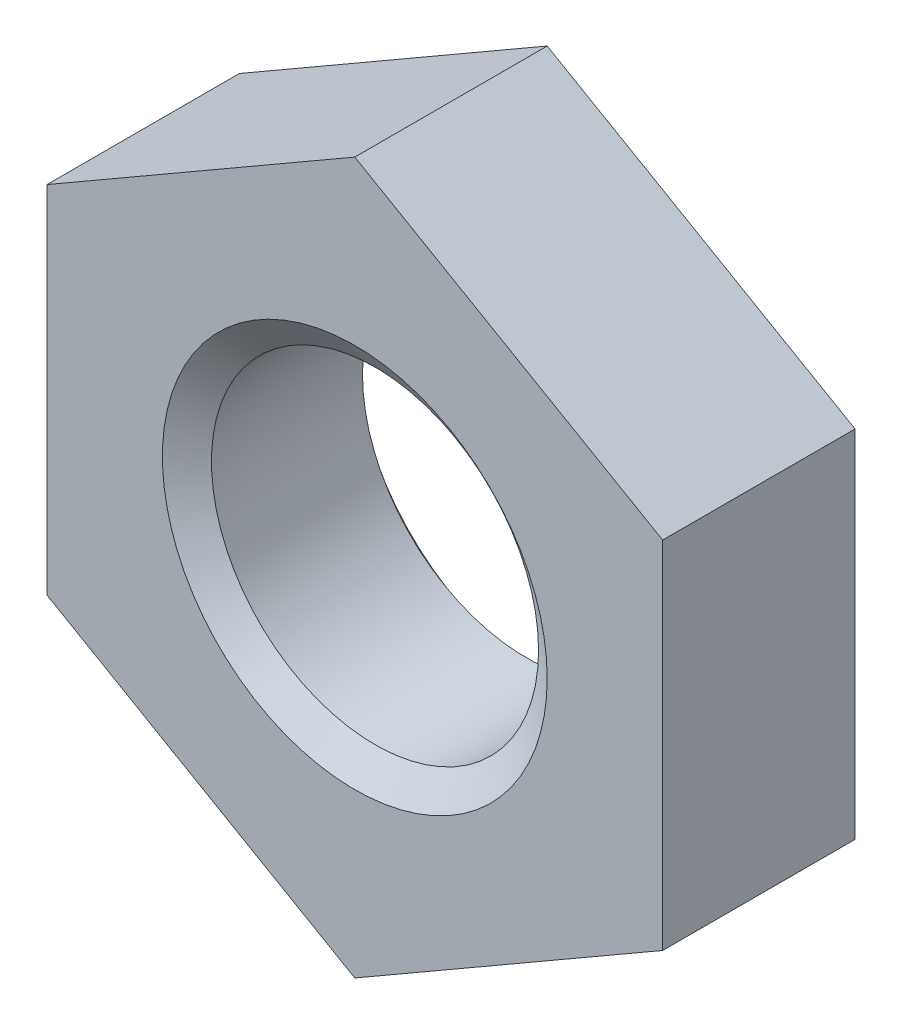
ISO-10303-21;
HEADER;
FILE_DESCRIPTION(('STEP AP214'),'2;1');
FILE_NAME('part.step','',(''),(''),'','','');
FILE_SCHEMA(('AUTOMOTIVE_DESIGN { 1 0 10303 214 1 1 1 1 }'));
ENDSEC;
DATA;
#1=APPLICATION_CONTEXT('core data for automotive mechanical design processes');
#2=APPLICATION_PROTOCOL_DEFINITION('international standard','automotive_design',2000,#1);
#3=PRODUCT_CONTEXT('',#1,'mechanical');
#4=PRODUCT('Part','Part','',(#3));
#5=PRODUCT_RELATED_PRODUCT_CATEGORY('part','',(#4));
#6=PRODUCT_DEFINITION_FORMATION('','',#4);
#7=PRODUCT_DEFINITION_CONTEXT('part definition',#1,'design');
#8=PRODUCT_DEFINITION('design','',#6,#7);
#9=PRODUCT_DEFINITION_SHAPE('','',#8);
#10=(LENGTH_UNIT() NAMED_UNIT(*) SI_UNIT(.MILLI.,.METRE.));
#11=(NAMED_UNIT(*) PLANE_ANGLE_UNIT() SI_UNIT($,.RADIAN.));
#12=(NAMED_UNIT(*) SI_UNIT($,.STERADIAN.) SOLID_ANGLE_UNIT());
#13=UNCERTAINTY_MEASURE_WITH_UNIT(LENGTH_MEASURE(1.E-05),#10,'distance_accuracy_value','');
#14=(GEOMETRIC_REPRESENTATION_CONTEXT(3) GLOBAL_UNCERTAINTY_ASSIGNED_CONTEXT((#13)) GLOBAL_UNIT_ASSIGNED_CONTEXT((#10,
#11,#12)) REPRESENTATION_CONTEXT('',''));
#15=CARTESIAN_POINT('',(0.,0.,0.));
#16=DIRECTION('',(0.,0.,1.));
#17=DIRECTION('',(1.,0.,0.));
#18=AXIS2_PLACEMENT_3D('',#15,#16,#17);
#19=CARTESIAN_POINT('',(0.,0.,-5.));
#20=DIRECTION('',(0.,0.,1.));
#21=DIRECTION('',(1.,0.,0.));
#22=AXIS2_PLACEMENT_3D('',#19,#20,#21);
#23=CYLINDRICAL_SURFACE('',#22,4.25);
#24=CARTESIAN_POINT('',(0.,0.,-0.525155653657285));
#25=DIRECTION('',(0.,0.,1.));
#26=DIRECTION('',(1.,0.,0.));
#27=AXIS2_PLACEMENT_3D('',#24,#25,#26);
#28=CIRCLE('',#27,4.25);
#29=CARTESIAN_POINT('',(4.25,0.,-0.525155653657285));
#30=VERTEX_POINT('',#29);
#31=EDGE_CURVE('E125',#30,#30,#28,.F.);
#32=ORIENTED_EDGE('',*,*,#31,.F.);
#33=EDGE_LOOP('',(#32));
#34=FACE_BOUND('',#33,.T.);
#35=CARTESIAN_POINT('',(0.,0.,-4.44944434634272));
#36=DIRECTION('',(0.,0.,-1.));
#37=DIRECTION('',(-1.,0.,0.));
#38=AXIS2_PLACEMENT_3D('',#35,#36,#37);
#39=CIRCLE('',#38,4.25);
#40=CARTESIAN_POINT('',(-4.25,0.,-4.44944434634272));
#41=VERTEX_POINT('',#40);
#42=EDGE_CURVE('E38',#41,#41,#39,.F.);
#43=ORIENTED_EDGE('',*,*,#42,.F.);
#44=EDGE_LOOP('',(#43));
#45=FACE_BOUND('',#44,.T.);
#46=ADVANCED_FACE('F34',(#34,#45),#23,.F.);
#47=CARTESIAN_POINT('',(0.,9.23760430703402,-5.));
#48=DIRECTION('',(-0.500000000000001,0.866025403784438,0.));
#49=DIRECTION('',(-0.866025403784438,-0.500000000000001,0.));
#50=AXIS2_PLACEMENT_3D('',#47,#48,#49);
#51=PLANE('',#50);
#52=DIRECTION('',(-0.866025403784438,-0.500000000000001,0.));
#53=VECTOR('',#52,1.);
#54=CARTESIAN_POINT('',(0.,9.23760430703402,0.));
#55=LINE('',#54,#53);
#56=CARTESIAN_POINT('',(0.,9.23760430703402,0.));
#57=VERTEX_POINT('',#56);
#58=CARTESIAN_POINT('',(-8.,4.618802153517,0.));
#59=VERTEX_POINT('',#58);
#60=EDGE_CURVE('E121',#57,#59,#55,.T.);
#61=ORIENTED_EDGE('',*,*,#60,.F.);
#62=DIRECTION('',(0.,0.,1.));
#63=VECTOR('',#62,1.);
#64=CARTESIAN_POINT('',(0.,9.23760430703402,-5.));
#65=LINE('',#64,#63);
#66=CARTESIAN_POINT('',(0.,9.23760430703402,-5.));
#67=VERTEX_POINT('',#66);
#68=EDGE_CURVE('E11',#67,#57,#65,.T.);
#69=ORIENTED_EDGE('',*,*,#68,.F.);
#70=DIRECTION('',(-0.866025403784438,-0.500000000000001,0.));
#71=VECTOR('',#70,1.);
#72=CARTESIAN_POINT('',(0.,9.23760430703402,-5.));
#73=LINE('',#72,#71);
#74=CARTESIAN_POINT('',(-8.,4.618802153517,-5.));
#75=VERTEX_POINT('',#74);
#76=EDGE_CURVE('E136',#67,#75,#73,.T.);
#77=ORIENTED_EDGE('',*,*,#76,.T.);
#78=DIRECTION('',(0.,0.,1.));
#79=VECTOR('',#78,1.);
#80=CARTESIAN_POINT('',(-8.,4.618802153517,-5.));
#81=LINE('',#80,#79);
#82=EDGE_CURVE('E85',#75,#59,#81,.T.);
#83=ORIENTED_EDGE('',*,*,#82,.T.);
#84=EDGE_LOOP('',(#61,#69,#77,#83));
#85=FACE_BOUND('',#84,.T.);
#86=ADVANCED_FACE('F36',(#85),#51,.T.);
#87=CARTESIAN_POINT('',(8.,4.618802153517,-5.));
#88=DIRECTION('',(0.500000000000001,0.866025403784438,0.));
#89=DIRECTION('',(-0.866025403784438,0.500000000000001,0.));
#90=AXIS2_PLACEMENT_3D('',#87,#88,#89);
#91=PLANE('',#90);
#92=DIRECTION('',(-0.866025403784438,0.500000000000001,0.));
#93=VECTOR('',#92,1.);
#94=CARTESIAN_POINT('',(8.,4.618802153517,0.));
#95=LINE('',#94,#93);
#96=CARTESIAN_POINT('',(8.,4.618802153517,0.));
#97=VERTEX_POINT('',#96);
#98=EDGE_CURVE('E134',#97,#57,#95,.T.);
#99=ORIENTED_EDGE('',*,*,#98,.F.);
#100=DIRECTION('',(0.,0.,1.));
#101=VECTOR('',#100,1.);
#102=CARTESIAN_POINT('',(8.,4.618802153517,-5.));
#103=LINE('',#102,#101);
#104=CARTESIAN_POINT('',(8.,4.618802153517,-5.));
#105=VERTEX_POINT('',#104);
#106=EDGE_CURVE('E44',#105,#97,#103,.T.);
#107=ORIENTED_EDGE('',*,*,#106,.F.);
#108=DIRECTION('',(-0.866025403784438,0.500000000000001,0.));
#109=VECTOR('',#108,1.);
#110=CARTESIAN_POINT('',(8.,4.618802153517,-5.));
#111=LINE('',#110,#109);
#112=EDGE_CURVE('E103',#105,#67,#111,.T.);
#113=ORIENTED_EDGE('',*,*,#112,.T.);
#114=ORIENTED_EDGE('',*,*,#68,.T.);
#115=EDGE_LOOP('',(#99,#107,#113,#114));
#116=FACE_BOUND('',#115,.T.);
#117=ADVANCED_FACE('F162',(#116),#91,.T.);
#118=CARTESIAN_POINT('',(8.,4.618802153517,-5.));
#119=DIRECTION('',(-1.,0.,0.));
#120=DIRECTION('',(0.,0.,1.));
#121=AXIS2_PLACEMENT_3D('',#118,#119,#120);
#122=PLANE('',#121);
#123=DIRECTION('',(0.,-1.,0.));
#124=VECTOR('',#123,1.);
#125=CARTESIAN_POINT('',(8.,4.618802153517,0.));
#126=LINE('',#125,#124);
#127=CARTESIAN_POINT('',(8.,-4.61880215351702,0.));
#128=VERTEX_POINT('',#127);
#129=EDGE_CURVE('E107',#97,#128,#126,.T.);
#130=ORIENTED_EDGE('',*,*,#129,.T.);
#131=DIRECTION('',(0.,0.,1.));
#132=VECTOR('',#131,1.);
#133=CARTESIAN_POINT('',(8.,-4.61880215351702,-5.));
#134=LINE('',#133,#132);
#135=CARTESIAN_POINT('',(8.,-4.61880215351702,-5.));
#136=VERTEX_POINT('',#135);
#137=EDGE_CURVE('E105',#136,#128,#134,.T.);
#138=ORIENTED_EDGE('',*,*,#137,.F.);
#139=DIRECTION('',(0.,-1.,0.));
#140=VECTOR('',#139,1.);
#141=CARTESIAN_POINT('',(8.,4.618802153517,-5.));
#142=LINE('',#141,#140);
#143=EDGE_CURVE('E96',#105,#136,#142,.T.);
#144=ORIENTED_EDGE('',*,*,#143,.F.);
#145=ORIENTED_EDGE('',*,*,#106,.T.);
#146=EDGE_LOOP('',(#130,#138,#144,#145));
#147=FACE_BOUND('',#146,.T.);
#148=ADVANCED_FACE('F106',(#147),#122,.F.);
#149=CARTESIAN_POINT('',(0.,-9.23760430703404,-5.));
#150=DIRECTION('',(0.500000000000001,-0.866025403784438,0.));
#151=DIRECTION('',(0.866025403784438,0.500000000000001,0.));
#152=AXIS2_PLACEMENT_3D('',#149,#150,#151);
#153=PLANE('',#152);
#154=DIRECTION('',(0.866025403784438,0.500000000000001,0.));
#155=VECTOR('',#154,1.);
#156=CARTESIAN_POINT('',(0.,-9.23760430703404,0.));
#157=LINE('',#156,#155);
#158=CARTESIAN_POINT('',(0.,-9.23760430703404,0.));
#159=VERTEX_POINT('',#158);
#160=EDGE_CURVE('E131',#159,#128,#157,.T.);
#161=ORIENTED_EDGE('',*,*,#160,.F.);
#162=DIRECTION('',(0.,0.,1.));
#163=VECTOR('',#162,1.);
#164=CARTESIAN_POINT('',(0.,-9.23760430703404,-5.));
#165=LINE('',#164,#163);
#166=CARTESIAN_POINT('',(0.,-9.23760430703404,-5.));
#167=VERTEX_POINT('',#166);
#168=EDGE_CURVE('E111',#167,#159,#165,.T.);
#169=ORIENTED_EDGE('',*,*,#168,.F.);
#170=DIRECTION('',(0.866025403784438,0.500000000000001,0.));
#171=VECTOR('',#170,1.);
#172=CARTESIAN_POINT('',(0.,-9.23760430703404,-5.));
#173=LINE('',#172,#171);
#174=EDGE_CURVE('E101',#167,#136,#173,.T.);
#175=ORIENTED_EDGE('',*,*,#174,.T.);
#176=ORIENTED_EDGE('',*,*,#137,.T.);
#177=EDGE_LOOP('',(#161,#169,#175,#176));
#178=FACE_BOUND('',#177,.T.);
#179=ADVANCED_FACE('F113',(#178),#153,.T.);
#180=CARTESIAN_POINT('',(-8.,-4.61880215351702,-5.));
#181=DIRECTION('',(-0.500000000000001,-0.866025403784438,0.));
#182=DIRECTION('',(0.866025403784438,-0.500000000000001,0.));
#183=AXIS2_PLACEMENT_3D('',#180,#181,#182);
#184=PLANE('',#183);
#185=DIRECTION('',(0.866025403784438,-0.500000000000001,0.));
#186=VECTOR('',#185,1.);
#187=CARTESIAN_POINT('',(-8.,-4.61880215351702,0.));
#188=LINE('',#187,#186);
#189=CARTESIAN_POINT('',(-8.,-4.61880215351702,0.));
#190=VERTEX_POINT('',#189);
#191=EDGE_CURVE('E128',#190,#159,#188,.T.);
#192=ORIENTED_EDGE('',*,*,#191,.F.);
#193=DIRECTION('',(0.,0.,1.));
#194=VECTOR('',#193,1.);
#195=CARTESIAN_POINT('',(-8.,-4.61880215351702,-5.));
#196=LINE('',#195,#194);
#197=CARTESIAN_POINT('',(-8.,-4.61880215351702,-5.));
#198=VERTEX_POINT('',#197);
#199=EDGE_CURVE('E140',#198,#190,#196,.T.);
#200=ORIENTED_EDGE('',*,*,#199,.F.);
#201=DIRECTION('',(0.866025403784438,-0.500000000000001,0.));
#202=VECTOR('',#201,1.);
#203=CARTESIAN_POINT('',(-8.,-4.61880215351702,-5.));
#204=LINE('',#203,#202);
#205=EDGE_CURVE('E114',#198,#167,#204,.T.);
#206=ORIENTED_EDGE('',*,*,#205,.T.);
#207=ORIENTED_EDGE('',*,*,#168,.T.);
#208=EDGE_LOOP('',(#192,#200,#206,#207));
#209=FACE_BOUND('',#208,.T.);
#210=ADVANCED_FACE('F239',(#209),#184,.T.);
#211=CARTESIAN_POINT('',(-8.,4.618802153517,-5.));
#212=DIRECTION('',(-1.,0.,0.));
#213=DIRECTION('',(0.,0.,1.));
#214=AXIS2_PLACEMENT_3D('',#211,#212,#213);
#215=PLANE('',#214);
#216=DIRECTION('',(0.,-1.,0.));
#217=VECTOR('',#216,1.);
#218=CARTESIAN_POINT('',(-8.,4.618802153517,0.));
#219=LINE('',#218,#217);
#220=EDGE_CURVE('E124',#59,#190,#219,.T.);
#221=ORIENTED_EDGE('',*,*,#220,.F.);
#222=ORIENTED_EDGE('',*,*,#82,.F.);
#223=DIRECTION('',(0.,-1.,0.));
#224=VECTOR('',#223,1.);
#225=CARTESIAN_POINT('',(-8.,4.618802153517,-5.));
#226=LINE('',#225,#224);
#227=EDGE_CURVE('E116',#75,#198,#226,.T.);
#228=ORIENTED_EDGE('',*,*,#227,.T.);
#229=ORIENTED_EDGE('',*,*,#199,.T.);
#230=EDGE_LOOP('',(#221,#222,#228,#229));
#231=FACE_BOUND('',#230,.T.);
#232=ADVANCED_FACE('F158',(#231),#215,.T.);
#233=CARTESIAN_POINT('',(-16.,0.,-5.));
#234=DIRECTION('',(0.,0.,1.));
#235=DIRECTION('',(1.,0.,0.));
#236=AXIS2_PLACEMENT_3D('',#233,#234,#235);
#237=PLANE('',#236);
#238=CARTESIAN_POINT('',(0.,0.,-5.));
#239=DIRECTION('',(0.,0.,1.));
#240=DIRECTION('',(1.,0.,0.));
#241=AXIS2_PLACEMENT_3D('',#238,#239,#240);
#242=CIRCLE('',#241,5.);
#243=CARTESIAN_POINT('',(5.,0.,-5.));
#244=VERTEX_POINT('',#243);
#245=EDGE_CURVE('E145',#244,#244,#242,.F.);
#246=ORIENTED_EDGE('',*,*,#245,.F.);
#247=EDGE_LOOP('',(#246));
#248=FACE_BOUND('',#247,.T.);
#249=ORIENTED_EDGE('',*,*,#76,.F.);
#250=ORIENTED_EDGE('',*,*,#112,.F.);
#251=ORIENTED_EDGE('',*,*,#143,.T.);
#252=ORIENTED_EDGE('',*,*,#174,.F.);
#253=ORIENTED_EDGE('',*,*,#205,.F.);
#254=ORIENTED_EDGE('',*,*,#227,.F.);
#255=EDGE_LOOP('',(#249,#250,#251,#252,#253,#254));
#256=FACE_BOUND('',#255,.T.);
#257=ADVANCED_FACE('F98',(#248,#256),#237,.F.);
#258=CARTESIAN_POINT('',(-16.,0.,0.));
#259=DIRECTION('',(0.,0.,1.));
#260=DIRECTION('',(1.,0.,0.));
#261=AXIS2_PLACEMENT_3D('',#258,#259,#260);
#262=PLANE('',#261);
#263=CARTESIAN_POINT('',(0.,0.,0.));
#264=DIRECTION('',(0.,0.,1.));
#265=DIRECTION('',(1.,0.,0.));
#266=AXIS2_PLACEMENT_3D('',#263,#264,#265);
#267=CIRCLE('',#266,5.);
#268=CARTESIAN_POINT('',(5.,0.,0.));
#269=VERTEX_POINT('',#268);
#270=EDGE_CURVE('E144',#269,#269,#267,.T.);
#271=ORIENTED_EDGE('',*,*,#270,.F.);
#272=EDGE_LOOP('',(#271));
#273=FACE_BOUND('',#272,.T.);
#274=ORIENTED_EDGE('',*,*,#60,.T.);
#275=ORIENTED_EDGE('',*,*,#220,.T.);
#276=ORIENTED_EDGE('',*,*,#191,.T.);
#277=ORIENTED_EDGE('',*,*,#160,.T.);
#278=ORIENTED_EDGE('',*,*,#129,.F.);
#279=ORIENTED_EDGE('',*,*,#98,.T.);
#280=EDGE_LOOP('',(#274,#275,#276,#277,#278,#279));
#281=FACE_BOUND('',#280,.T.);
#282=ADVANCED_FACE('F161',(#273,#281),#262,.T.);
#283=CARTESIAN_POINT('',(0.,0.,-0.577671219023013));
#284=DIRECTION('',(0.,0.,1.));
#285=DIRECTION('',(1.,0.,0.));
#286=AXIS2_PLACEMENT_3D('',#283,#284,#285);
#287=CONICAL_SURFACE('',#286,4.175,0.959931088596879);
#288=ORIENTED_EDGE('',*,*,#270,.T.);
#289=EDGE_LOOP('',(#288));
#290=FACE_BOUND('',#289,.T.);
#291=ORIENTED_EDGE('',*,*,#31,.T.);
#292=EDGE_LOOP('',(#291));
#293=FACE_BOUND('',#292,.T.);
#294=ADVANCED_FACE('F180',(#290,#293),#287,.F.);
#295=CARTESIAN_POINT('',(0.,0.,-4.9746));
#296=DIRECTION('',(0.,0.,-1.));
#297=DIRECTION('',(-1.,0.,0.));
#298=AXIS2_PLACEMENT_3D('',#295,#296,#297);
#299=CONICAL_SURFACE('',#298,5.,0.959931088596881);
#300=CARTESIAN_POINT('',(0.,0.,-4.9746));
#301=DIRECTION('',(0.,0.,1.));
#302=DIRECTION('',(1.,0.,0.));
#303=AXIS2_PLACEMENT_3D('',#300,#301,#302);
#304=CIRCLE('',#303,5.);
#305=CARTESIAN_POINT('',(5.,0.,-4.9746));
#306=VERTEX_POINT('',#305);
#307=EDGE_CURVE('E147',#306,#306,#304,.T.);
#308=ORIENTED_EDGE('',*,*,#307,.F.);
#309=EDGE_LOOP('',(#308));
#310=FACE_BOUND('',#309,.T.);
#311=ORIENTED_EDGE('',*,*,#42,.T.);
#312=EDGE_LOOP('',(#311));
#313=FACE_BOUND('',#312,.T.);
#314=ADVANCED_FACE('F189',(#310,#313),#299,.F.);
#315=CARTESIAN_POINT('',(0.,0.,-25.0375057290932));
#316=DIRECTION('',(0.,0.,1.));
#317=DIRECTION('',(1.,0.,0.));
#318=AXIS2_PLACEMENT_3D('',#315,#316,#317);
#319=CYLINDRICAL_SURFACE('',#318,5.);
#320=ORIENTED_EDGE('',*,*,#307,.T.);
#321=EDGE_LOOP('',(#320));
#322=FACE_BOUND('',#321,.T.);
#323=ORIENTED_EDGE('',*,*,#245,.T.);
#324=EDGE_LOOP('',(#323));
#325=FACE_BOUND('',#324,.T.);
#326=ADVANCED_FACE('F196',(#322,#325),#319,.F.);
#327=CLOSED_SHELL('',(#46,#86,#117,#148,#179,#210,#232,#257,#282,#294,#314,#326));
#328=MANIFOLD_SOLID_BREP('B2',#327);
#329=ADVANCED_BREP_SHAPE_REPRESENTATION('',(#18,#328),#14);
#330=SHAPE_DEFINITION_REPRESENTATION(#9,#329);
ENDSEC;
END-ISO-10303-21;
